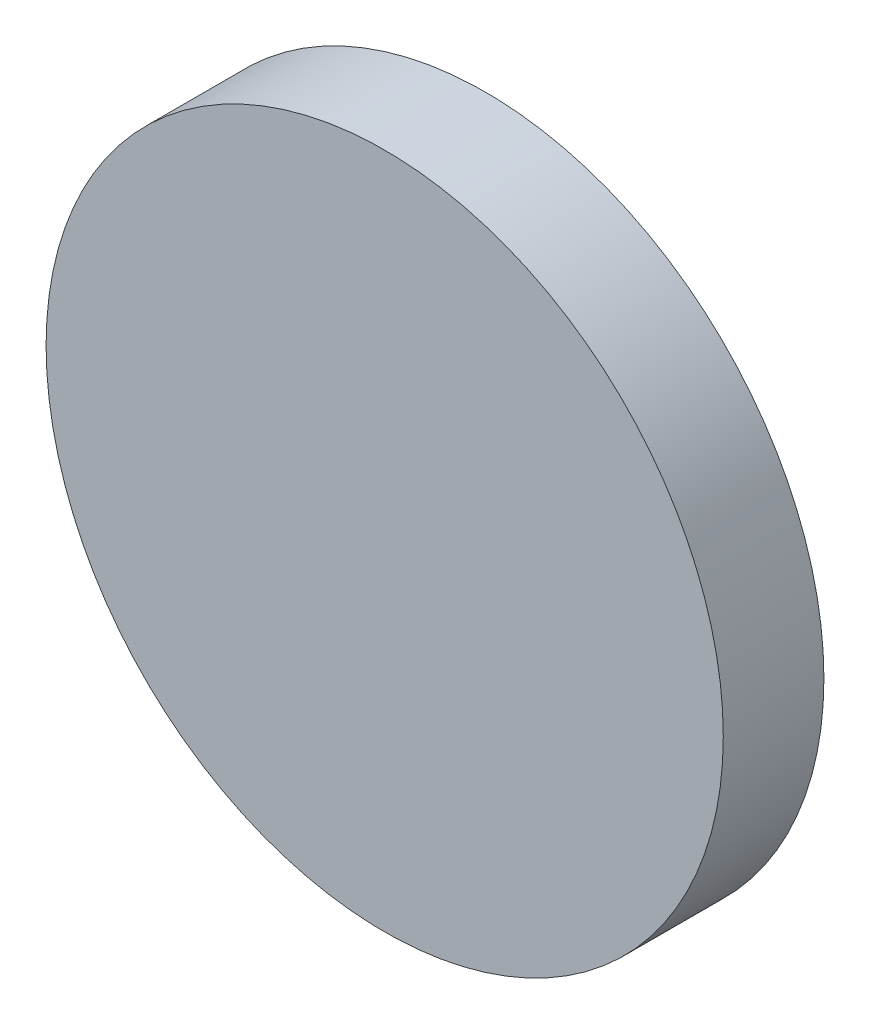
ISO-10303-21;
HEADER;
FILE_DESCRIPTION(('STEP AP214'),'2;1');
FILE_NAME('part.step','',(''),(''),'','','');
FILE_SCHEMA(('AUTOMOTIVE_DESIGN { 1 0 10303 214 1 1 1 1 }'));
ENDSEC;
DATA;
#1=APPLICATION_CONTEXT('core data for automotive mechanical design processes');
#2=APPLICATION_PROTOCOL_DEFINITION('international standard','automotive_design',2000,#1);
#3=PRODUCT_CONTEXT('',#1,'mechanical');
#4=PRODUCT('Part','Part','',(#3));
#5=PRODUCT_RELATED_PRODUCT_CATEGORY('part','',(#4));
#6=PRODUCT_DEFINITION_FORMATION('','',#4);
#7=PRODUCT_DEFINITION_CONTEXT('part definition',#1,'design');
#8=PRODUCT_DEFINITION('design','',#6,#7);
#9=PRODUCT_DEFINITION_SHAPE('','',#8);
#10=(LENGTH_UNIT() NAMED_UNIT(*) SI_UNIT(.MILLI.,.METRE.));
#11=(NAMED_UNIT(*) PLANE_ANGLE_UNIT() SI_UNIT($,.RADIAN.));
#12=(NAMED_UNIT(*) SI_UNIT($,.STERADIAN.) SOLID_ANGLE_UNIT());
#13=UNCERTAINTY_MEASURE_WITH_UNIT(LENGTH_MEASURE(1.E-05),#10,'distance_accuracy_value','');
#14=(GEOMETRIC_REPRESENTATION_CONTEXT(3) GLOBAL_UNCERTAINTY_ASSIGNED_CONTEXT((#13)) GLOBAL_UNIT_ASSIGNED_CONTEXT((#10,
#11,#12)) REPRESENTATION_CONTEXT('',''));
#15=CARTESIAN_POINT('',(0.,0.,0.));
#16=DIRECTION('',(0.,0.,1.));
#17=DIRECTION('',(1.,0.,0.));
#18=AXIS2_PLACEMENT_3D('',#15,#16,#17);
#19=CARTESIAN_POINT('',(1.497884237543,2.962827960865,0.));
#20=DIRECTION('',(0.,0.,1.));
#21=DIRECTION('',(-1.,0.,0.));
#22=AXIS2_PLACEMENT_3D('',#19,#20,#21);
#23=CYLINDRICAL_SURFACE('',#22,0.336486121346105);
#24=CARTESIAN_POINT('',(1.497884237543,2.962827960865,0.1));
#25=DIRECTION('',(0.,0.,1.));
#26=DIRECTION('',(-1.,0.,0.));
#27=AXIS2_PLACEMENT_3D('',#24,#25,#26);
#28=CIRCLE('',#27,0.336486121346105);
#29=CARTESIAN_POINT('',(1.834370358889,2.962827960865,0.1));
#30=VERTEX_POINT('',#29);
#31=EDGE_CURVE('E11',#30,#30,#28,.T.);
#32=ORIENTED_EDGE('',*,*,#31,.F.);
#33=CARTESIAN_POINT('',(1.834370358889,2.962827960865,0.));
#34=CARTESIAN_POINT('',(1.834370358889,2.962827960865,0.1));
#35=B_SPLINE_CURVE_WITH_KNOTS('',1,(#33,#34),.UNSPECIFIED.,.F.,.F.,(2,2),(0.,0.1),.UNSPECIFIED.);
#36=CARTESIAN_POINT('',(1.834370358889,2.962827960865,0.));
#37=VERTEX_POINT('',#36);
#38=EDGE_CURVE('E24',#37,#30,#35,.T.);
#39=ORIENTED_EDGE('',*,*,#38,.F.);
#40=CARTESIAN_POINT('',(1.497884237543,2.962827960865,0.));
#41=DIRECTION('',(0.,0.,-1.));
#42=DIRECTION('',(-1.,0.,0.));
#43=AXIS2_PLACEMENT_3D('',#40,#41,#42);
#44=CIRCLE('',#43,0.336486121346105);
#45=EDGE_CURVE('E33',#37,#37,#44,.T.);
#46=ORIENTED_EDGE('',*,*,#45,.F.);
#47=ORIENTED_EDGE('',*,*,#38,.T.);
#48=EDGE_LOOP('',(#32,#39,#46,#47));
#49=FACE_BOUND('',#48,.T.);
#50=ADVANCED_FACE('F17',(#49),#23,.T.);
#51=CARTESIAN_POINT('',(1.497884237543,2.962827960865,0.));
#52=DIRECTION('',(0.,0.,1.));
#53=DIRECTION('',(1.,0.,0.));
#54=AXIS2_PLACEMENT_3D('',#51,#52,#53);
#55=PLANE('',#54);
#56=ORIENTED_EDGE('',*,*,#45,.T.);
#57=EDGE_LOOP('',(#56));
#58=FACE_BOUND('',#57,.T.);
#59=ADVANCED_FACE('F35',(#58),#55,.F.);
#60=CARTESIAN_POINT('',(1.497884237543,2.962827960865,0.1));
#61=DIRECTION('',(0.,0.,1.));
#62=DIRECTION('',(1.,0.,0.));
#63=AXIS2_PLACEMENT_3D('',#60,#61,#62);
#64=PLANE('',#63);
#65=ORIENTED_EDGE('',*,*,#31,.T.);
#66=EDGE_LOOP('',(#65));
#67=FACE_BOUND('',#66,.T.);
#68=ADVANCED_FACE('F43',(#67),#64,.T.);
#69=CLOSED_SHELL('',(#50,#59,#68));
#70=MANIFOLD_SOLID_BREP('B1',#69);
#71=ADVANCED_BREP_SHAPE_REPRESENTATION('',(#18,#70),#14);
#72=SHAPE_DEFINITION_REPRESENTATION(#9,#71);
ENDSEC;
END-ISO-10303-21;
